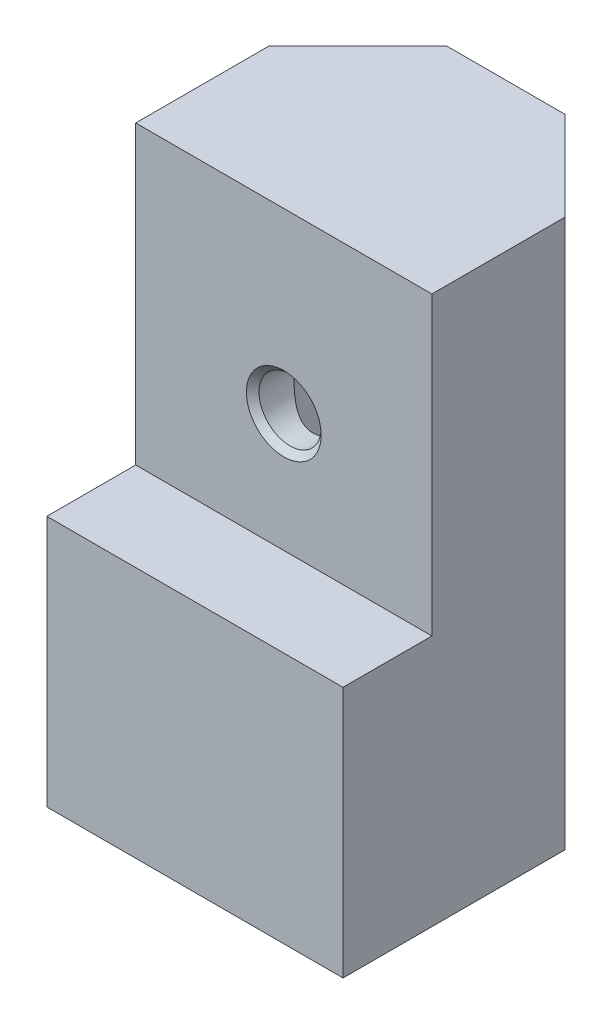
ISO-10303-21;
HEADER;
FILE_DESCRIPTION(('STEP AP214'),'2;1');
FILE_NAME('part.step','',(''),(''),'','','');
FILE_SCHEMA(('AUTOMOTIVE_DESIGN { 1 0 10303 214 1 1 1 1 }'));
ENDSEC;
DATA;
#1=APPLICATION_CONTEXT('core data for automotive mechanical design processes');
#2=APPLICATION_PROTOCOL_DEFINITION('international standard','automotive_design',2000,#1);
#3=PRODUCT_CONTEXT('',#1,'mechanical');
#4=PRODUCT('Part','Part','',(#3));
#5=PRODUCT_RELATED_PRODUCT_CATEGORY('part','',(#4));
#6=PRODUCT_DEFINITION_FORMATION('','',#4);
#7=PRODUCT_DEFINITION_CONTEXT('part definition',#1,'design');
#8=PRODUCT_DEFINITION('design','',#6,#7);
#9=PRODUCT_DEFINITION_SHAPE('','',#8);
#10=(LENGTH_UNIT() NAMED_UNIT(*) SI_UNIT(.MILLI.,.METRE.));
#11=(NAMED_UNIT(*) PLANE_ANGLE_UNIT() SI_UNIT($,.RADIAN.));
#12=(NAMED_UNIT(*) SI_UNIT($,.STERADIAN.) SOLID_ANGLE_UNIT());
#13=UNCERTAINTY_MEASURE_WITH_UNIT(LENGTH_MEASURE(1.E-05),#10,'distance_accuracy_value','');
#14=(GEOMETRIC_REPRESENTATION_CONTEXT(3) GLOBAL_UNCERTAINTY_ASSIGNED_CONTEXT((#13)) GLOBAL_UNIT_ASSIGNED_CONTEXT((#10,
#11,#12)) REPRESENTATION_CONTEXT('',''));
#15=CARTESIAN_POINT('',(0.,0.,0.));
#16=DIRECTION('',(0.,0.,1.));
#17=DIRECTION('',(1.,0.,0.));
#18=AXIS2_PLACEMENT_3D('',#15,#16,#17);
#19=CARTESIAN_POINT('',(0.,16.5,0.));
#20=DIRECTION('',(0.,0.,1.));
#21=DIRECTION('',(1.,0.,0.));
#22=AXIS2_PLACEMENT_3D('',#19,#20,#21);
#23=CYLINDRICAL_SURFACE('',#22,2.09999999999999);
#24=CARTESIAN_POINT('',(0.,16.5,-0.425000000000001));
#25=DIRECTION('',(0.,0.,1.));
#26=DIRECTION('',(1.,0.,0.));
#27=AXIS2_PLACEMENT_3D('',#24,#25,#26);
#28=CIRCLE('',#27,2.1);
#29=CARTESIAN_POINT('',(2.1,16.5,-0.425000000000001));
#30=VERTEX_POINT('',#29);
#31=EDGE_CURVE('E186',#30,#30,#28,.T.);
#32=ORIENTED_EDGE('',*,*,#31,.T.);
#33=EDGE_LOOP('',(#32));
#34=FACE_BOUND('',#33,.T.);
#35=CARTESIAN_POINT('',(0.,16.5,-9.8));
#36=DIRECTION('',(0.,0.,1.));
#37=DIRECTION('',(1.,0.,0.));
#38=AXIS2_PLACEMENT_3D('',#35,#36,#37);
#39=CIRCLE('',#38,2.09999999999999);
#40=CARTESIAN_POINT('',(2.09999999999999,16.5,-9.8));
#41=VERTEX_POINT('',#40);
#42=EDGE_CURVE('E189',#41,#41,#39,.T.);
#43=ORIENTED_EDGE('',*,*,#42,.F.);
#44=EDGE_LOOP('',(#43));
#45=FACE_BOUND('',#44,.T.);
#46=DIRECTION('',(0.,0.,1.));
#47=VECTOR('',#46,1.);
#48=CARTESIAN_POINT('',(2.1,16.5,0.));
#49=LINE('',#48,#47);
#50=CARTESIAN_POINT('',(2.1,16.5,-2.78810036394053));
#51=VERTEX_POINT('',#50);
#52=CARTESIAN_POINT('',(2.1,16.5,-7.21189963605947));
#53=VERTEX_POINT('',#52);
#54=EDGE_CURVE('E125',#51,#53,#49,.F.);
#55=ORIENTED_EDGE('',*,*,#54,.F.);
#56=CARTESIAN_POINT('',(2.1,16.5,-2.78810036394053));
#57=CARTESIAN_POINT('',(2.10001406550202,16.44890564578,-2.78813122960637));
#58=CARTESIAN_POINT('',(2.09813591396976,16.3978309349453,-2.78633076818849));
#59=CARTESIAN_POINT('',(2.09070878581308,16.2962603617513,-2.7793056900791));
#60=CARTESIAN_POINT('',(2.08516529758865,16.2457637485934,-2.77408619308978));
#61=CARTESIAN_POINT('',(2.07059789933959,16.1462622089026,-2.76053225536017));
#62=CARTESIAN_POINT('',(2.06161140051655,16.0972471565233,-2.75223132612759));
#63=CARTESIAN_POINT('',(2.04033021335461,16.0004917958691,-2.73289602787303));
#64=CARTESIAN_POINT('',(2.02803443434097,15.9527519135781,-2.7218607577605));
#65=CARTESIAN_POINT('',(1.98662417018042,15.8124015041972,-2.68544440520967));
#66=CARTESIAN_POINT('',(1.95288630713199,15.7220005483784,-2.65665274536502));
#67=CARTESIAN_POINT('',(1.87432121286916,15.5481200215617,-2.5933490864818));
#68=CARTESIAN_POINT('',(1.82946027170129,15.4646625399468,-2.55881980573055));
#69=CARTESIAN_POINT('',(1.72126821431826,15.2919981107851,-2.48109648006271));
#70=CARTESIAN_POINT('',(1.65610436927869,15.2041543502147,-2.43741786333745));
#71=CARTESIAN_POINT('',(1.51288716119124,15.0394906861281,-2.35033763996556));
#72=CARTESIAN_POINT('',(1.43482699231496,14.9626766435914,-2.30693619221924));
#73=CARTESIAN_POINT('',(1.25307146604847,14.8100170616356,-2.21716908070368));
#74=CARTESIAN_POINT('',(1.14727349331478,14.7362693244472,-2.17143013855408));
#75=CARTESIAN_POINT('',(0.921039956696543,14.6083128106554,-2.08992195742543));
#76=CARTESIAN_POINT('',(0.800631462785345,14.5540686159494,-2.05413467346997));
#77=CARTESIAN_POINT('',(0.581766959089313,14.4798028224355,-2.0044767996672));
#78=CARTESIAN_POINT('',(0.48582187503762,14.4545388431992,-1.98732083723429));
#79=CARTESIAN_POINT('',(0.290171999516886,14.4177700899993,-1.9622383894417));
#80=CARTESIAN_POINT('',(0.190470256332846,14.4062543980712,-1.9543045806005));
#81=CARTESIAN_POINT('',(-0.0100357823659216,14.3976231729419,-1.94836457385758));
#82=CARTESIAN_POINT('',(-0.110841743212122,14.4005336706207,-1.95037632188338));
#83=CARTESIAN_POINT('',(-0.310340753496205,14.4206381075267,-1.96418159812264));
#84=CARTESIAN_POINT('',(-0.409033179059682,14.4378362061511,-1.97597797482941));
#85=CARTESIAN_POINT('',(-0.59961992575892,14.4850787360832,-2.00799157758927));
#86=CARTESIAN_POINT('',(-0.691611709166461,14.514854663305,-2.02803258109019));
#87=CARTESIAN_POINT('',(-0.869119023411998,14.5858993090503,-2.07500891605762));
#88=CARTESIAN_POINT('',(-0.954633392230693,14.6271700835164,-2.10194548077899));
#89=CARTESIAN_POINT('',(-1.12720624367349,14.7250831477644,-2.16429143398575));
#90=CARTESIAN_POINT('',(-1.21335468088979,14.7829329037665,-2.20031329893575));
#91=CARTESIAN_POINT('',(-1.37528820402201,14.9096620634372,-2.27619794390948));
#92=CARTESIAN_POINT('',(-1.4510612472954,14.978554085896,-2.31606509720986));
#93=CARTESIAN_POINT('',(-1.60377665051855,15.1390367903445,-2.40395775706974));
#94=CARTESIAN_POINT('',(-1.67864220745733,15.2324919452245,-2.45219893140183));
#95=CARTESIAN_POINT('',(-1.81209350603637,15.4319643949111,-2.54532526320275));
#96=CARTESIAN_POINT('',(-1.87068403840911,15.5379779798706,-2.59021140541254));
#97=CARTESIAN_POINT('',(-1.95753033435109,15.7341115195755,-2.66057706952803));
#98=CARTESIAN_POINT('',(-1.98970157463716,15.8217540044552,-2.68811635077189));
#99=CARTESIAN_POINT('',(-2.04237434747996,16.0025061717334,-2.734508457242));
#100=CARTESIAN_POINT('',(-2.06291693598073,16.0955953230122,-2.75339179749609));
#101=CARTESIAN_POINT('',(-2.08463272386927,16.241237318493,-2.77358753707706));
#102=CARTESIAN_POINT('',(-2.09037039538955,16.2925842608368,-2.77898731101835));
#103=CARTESIAN_POINT('',(-2.09806402040135,16.395939884468,-2.78626161901712));
#104=CARTESIAN_POINT('',(-2.10001013542928,16.4479499357716,-2.78812698151683));
#105=CARTESIAN_POINT('',(-2.09999999999999,16.5,-2.78810036394053));
#106=B_SPLINE_CURVE_WITH_KNOTS('',3,(#56,#57,#58,#59,#60,#61,#62,#63,#64,#65,#66,#67,#68,#69,
#70,#71,#72,#73,#74,#75,#76,#77,#78,#79,#80,#81,#82,#83,#84,#85,#86,#87,#88,#89,#90,#91,#92,#93,
#94,#95,#96,#97,#98,#99,#100,#101,#102,#103,#104,#105),.UNSPECIFIED.,.F.,.F.,(4,2,2,2,2,2,2,2,2,
2,2,2,2,2,2,2,2,2,2,2,2,2,2,2,4),(0.,0.153185243370379,0.306141628187108,0.45748110256166,
0.608870516710041,0.909651176419752,1.21135477861481,1.56338559805909,1.91560279307157,
2.32384851334951,2.73134907659973,3.03211266815019,3.33263725428451,3.63370430967053,
3.93485904223187,4.22988618534556,4.52496613027641,4.85326702019536,5.18194579362882,
5.56763385280446,5.95320825985618,6.24423203568071,6.5342218143046,6.68982713941108,
6.84583569970781),.UNSPECIFIED.);
#107=CARTESIAN_POINT('',(-2.09999999999999,16.5,-2.78810036394053));
#108=VERTEX_POINT('',#107);
#109=EDGE_CURVE('E140',#51,#108,#106,.T.);
#110=ORIENTED_EDGE('',*,*,#109,.T.);
#111=DIRECTION('',(0.,0.,1.));
#112=VECTOR('',#111,1.);
#113=CARTESIAN_POINT('',(-2.09999999999999,16.5,0.));
#114=LINE('',#113,#112);
#115=CARTESIAN_POINT('',(-2.09999999999999,16.5,-7.21189963605947));
#116=VERTEX_POINT('',#115);
#117=EDGE_CURVE('E144',#116,#108,#114,.T.);
#118=ORIENTED_EDGE('',*,*,#117,.F.);
#119=CARTESIAN_POINT('',(-2.09999999999999,16.5,-7.21189963605947));
#120=CARTESIAN_POINT('',(-2.10001406550202,16.44890564578,-7.21186877039364));
#121=CARTESIAN_POINT('',(-2.09813591396976,16.3978309349453,-7.21366923181151));
#122=CARTESIAN_POINT('',(-2.09070878581308,16.2962603617513,-7.2206943099209));
#123=CARTESIAN_POINT('',(-2.08516529758865,16.2457637485934,-7.22591380691022));
#124=CARTESIAN_POINT('',(-2.07059789933958,16.1462622089026,-7.23946774463983));
#125=CARTESIAN_POINT('',(-2.06161140051654,16.0972471565233,-7.24776867387241));
#126=CARTESIAN_POINT('',(-2.04033021335461,16.0004917958691,-7.26710397212697));
#127=CARTESIAN_POINT('',(-2.02803443434096,15.9527519135781,-7.2781392422395));
#128=CARTESIAN_POINT('',(-1.98662417018042,15.8124015041972,-7.31455559479033));
#129=CARTESIAN_POINT('',(-1.95288630713199,15.7220005483784,-7.34334725463498));
#130=CARTESIAN_POINT('',(-1.87432121286915,15.5481200215617,-7.4066509135182));
#131=CARTESIAN_POINT('',(-1.82946027170128,15.4646625399468,-7.44118019426945));
#132=CARTESIAN_POINT('',(-1.72126821431826,15.2919981107851,-7.51890351993729));
#133=CARTESIAN_POINT('',(-1.65610436927869,15.2041543502147,-7.56258213666256));
#134=CARTESIAN_POINT('',(-1.51288716119123,15.0394906861281,-7.64966236003444));
#135=CARTESIAN_POINT('',(-1.43482699231496,14.9626766435914,-7.69306380778076));
#136=CARTESIAN_POINT('',(-1.25307146604846,14.8100170616356,-7.78283091929632));
#137=CARTESIAN_POINT('',(-1.14727349331478,14.7362693244472,-7.82856986144592));
#138=CARTESIAN_POINT('',(-0.921039956696539,14.6083128106554,-7.91007804257457));
#139=CARTESIAN_POINT('',(-0.800631462785341,14.5540686159494,-7.94586532653003));
#140=CARTESIAN_POINT('',(-0.581766959089311,14.4798028224355,-7.99552320033279));
#141=CARTESIAN_POINT('',(-0.485821875037618,14.4545388431992,-8.0126791627657));
#142=CARTESIAN_POINT('',(-0.290171999516883,14.4177700899993,-8.0377616105583));
#143=CARTESIAN_POINT('',(-0.190470256332844,14.4062543980712,-8.04569541939949));
#144=CARTESIAN_POINT('',(0.0100357823659245,14.3976231729419,-8.05163542614242));
#145=CARTESIAN_POINT('',(0.110841743212125,14.4005336706207,-8.04962367811662));
#146=CARTESIAN_POINT('',(0.310340753496208,14.4206381075267,-8.03581840187736));
#147=CARTESIAN_POINT('',(0.409033179059685,14.4378362061511,-8.02402202517059));
#148=CARTESIAN_POINT('',(0.599619925758922,14.4850787360832,-7.99200842241073));
#149=CARTESIAN_POINT('',(0.691611709166463,14.514854663305,-7.97196741890981));
#150=CARTESIAN_POINT('',(0.869119023412,14.5858993090503,-7.92499108394238));
#151=CARTESIAN_POINT('',(0.954633392230695,14.6271700835164,-7.89805451922101));
#152=CARTESIAN_POINT('',(1.12720624367349,14.7250831477644,-7.83570856601425));
#153=CARTESIAN_POINT('',(1.21335468088979,14.7829329037665,-7.79968670106425));
#154=CARTESIAN_POINT('',(1.37528820402201,14.9096620634372,-7.72380205609051));
#155=CARTESIAN_POINT('',(1.4510612472954,14.978554085896,-7.68393490279013));
#156=CARTESIAN_POINT('',(1.60377665051855,15.1390367903445,-7.59604224293026));
#157=CARTESIAN_POINT('',(1.67864220745734,15.2324919452245,-7.54780106859816));
#158=CARTESIAN_POINT('',(1.81209350603637,15.4319643949111,-7.45467473679724));
#159=CARTESIAN_POINT('',(1.87068403840912,15.5379779798706,-7.40978859458746));
#160=CARTESIAN_POINT('',(1.95753033435109,15.7341115195755,-7.33942293047197));
#161=CARTESIAN_POINT('',(1.98970157463716,15.8217540044552,-7.31188364922811));
#162=CARTESIAN_POINT('',(2.04237434747997,16.0025061717334,-7.26549154275799));
#163=CARTESIAN_POINT('',(2.06291693598074,16.0955953230122,-7.24660820250391));
#164=CARTESIAN_POINT('',(2.08463272386927,16.241237318493,-7.22641246292294));
#165=CARTESIAN_POINT('',(2.09037039538955,16.2925842608368,-7.22101268898165));
#166=CARTESIAN_POINT('',(2.09806402040135,16.395939884468,-7.21373838098287));
#167=CARTESIAN_POINT('',(2.10001013542928,16.4479499357716,-7.21187301848316));
#168=CARTESIAN_POINT('',(2.1,16.5,-7.21189963605947));
#169=B_SPLINE_CURVE_WITH_KNOTS('',3,(#119,#120,#121,#122,#123,#124,#125,#126,#127,#128,#129,
#130,#131,#132,#133,#134,#135,#136,#137,#138,#139,#140,#141,#142,#143,#144,#145,#146,#147,#148,
#149,#150,#151,#152,#153,#154,#155,#156,#157,#158,#159,#160,#161,#162,#163,#164,#165,#166,#167,
#168),.UNSPECIFIED.,.F.,.F.,(4,2,2,2,2,2,2,2,2,2,2,2,2,2,2,2,2,2,2,2,2,2,2,2,4),(0.,
0.153185243370379,0.306141628187108,0.45748110256166,0.608870516710041,0.909651176419752,
1.21135477861481,1.56338559805909,1.91560279307157,2.32384851334951,2.73134907659973,
3.03211266815019,3.33263725428451,3.63370430967053,3.93485904223187,4.22988618534556,
4.52496613027641,4.85326702019536,5.18194579362881,5.56763385280446,5.95320825985617,
6.24423203568071,6.53422181430459,6.68982713941108,6.84583569970781),.UNSPECIFIED.);
#170=EDGE_CURVE('E133',#116,#53,#169,.T.);
#171=ORIENTED_EDGE('',*,*,#170,.T.);
#172=EDGE_LOOP('',(#55,#110,#118,#171));
#173=FACE_BOUND('',#172,.T.);
#174=ADVANCED_FACE('F43',(#34,#45,#173),#23,.F.);
#175=CARTESIAN_POINT('',(-10.,8.5,6.));
#176=DIRECTION('',(1.,0.,0.));
#177=DIRECTION('',(0.,1.,0.));
#178=AXIS2_PLACEMENT_3D('',#175,#176,#177);
#179=PLANE('',#178);
#180=DIRECTION('',(0.,0.,1.));
#181=VECTOR('',#180,1.);
#182=CARTESIAN_POINT('',(-10.,28.5,-15.));
#183=LINE('',#182,#181);
#184=CARTESIAN_POINT('',(-10.,28.5,-8.99999999999998));
#185=VERTEX_POINT('',#184);
#186=CARTESIAN_POINT('',(-10.,28.5,0.));
#187=VERTEX_POINT('',#186);
#188=EDGE_CURVE('E212',#185,#187,#183,.T.);
#189=ORIENTED_EDGE('',*,*,#188,.F.);
#190=DIRECTION('',(0.,-1.,0.));
#191=VECTOR('',#190,1.);
#192=CARTESIAN_POINT('',(-10.,8.5,-8.99999999999998));
#193=LINE('',#192,#191);
#194=CARTESIAN_POINT('',(-10.,-8.5,-8.99999999999998));
#195=VERTEX_POINT('',#194);
#196=EDGE_CURVE('E66',#185,#195,#193,.T.);
#197=ORIENTED_EDGE('',*,*,#196,.T.);
#198=DIRECTION('',(0.,0.,-1.));
#199=VECTOR('',#198,1.);
#200=CARTESIAN_POINT('',(-10.,-8.5,6.));
#201=LINE('',#200,#199);
#202=CARTESIAN_POINT('',(-10.,-8.5,6.));
#203=VERTEX_POINT('',#202);
#204=EDGE_CURVE('E234',#203,#195,#201,.T.);
#205=ORIENTED_EDGE('',*,*,#204,.F.);
#206=DIRECTION('',(0.,-1.,0.));
#207=VECTOR('',#206,1.);
#208=CARTESIAN_POINT('',(-10.,8.5,6.));
#209=LINE('',#208,#207);
#210=CARTESIAN_POINT('',(-10.,8.5,6.));
#211=VERTEX_POINT('',#210);
#212=EDGE_CURVE('E215',#211,#203,#209,.T.);
#213=ORIENTED_EDGE('',*,*,#212,.F.);
#214=DIRECTION('',(0.,0.,-1.));
#215=VECTOR('',#214,1.);
#216=CARTESIAN_POINT('',(-10.,8.5,6.));
#217=LINE('',#216,#215);
#218=CARTESIAN_POINT('',(-10.,8.5,0.));
#219=VERTEX_POINT('',#218);
#220=EDGE_CURVE('E224',#211,#219,#217,.T.);
#221=ORIENTED_EDGE('',*,*,#220,.T.);
#222=DIRECTION('',(0.,1.,0.));
#223=VECTOR('',#222,1.);
#224=CARTESIAN_POINT('',(-10.,-8.5,0.));
#225=LINE('',#224,#223);
#226=EDGE_CURVE('E194',#219,#187,#225,.T.);
#227=ORIENTED_EDGE('',*,*,#226,.T.);
#228=EDGE_LOOP('',(#189,#197,#205,#213,#221,#227));
#229=FACE_BOUND('',#228,.T.);
#230=ADVANCED_FACE('F177',(#229),#179,.F.);
#231=CARTESIAN_POINT('',(-10.,-8.5,6.));
#232=DIRECTION('',(0.,1.,0.));
#233=DIRECTION('',(0.,0.,1.));
#234=AXIS2_PLACEMENT_3D('',#231,#232,#233);
#235=PLANE('',#234);
#236=CARTESIAN_POINT('',(0.,-8.5,-5.));
#237=DIRECTION('',(0.,-1.,0.));
#238=DIRECTION('',(0.,0.,-1.));
#239=AXIS2_PLACEMENT_3D('',#236,#237,#238);
#240=CIRCLE('',#239,3.05);
#241=CARTESIAN_POINT('',(0.,-8.5,-8.05));
#242=VERTEX_POINT('',#241);
#243=EDGE_CURVE('E237',#242,#242,#240,.T.);
#244=ORIENTED_EDGE('',*,*,#243,.F.);
#245=EDGE_LOOP('',(#244));
#246=FACE_BOUND('',#245,.T.);
#247=ORIENTED_EDGE('',*,*,#204,.T.);
#248=DIRECTION('',(-0.707106781186546,0.,0.707106781186549));
#249=VECTOR('',#248,1.);
#250=CARTESIAN_POINT('',(-4.,-8.5,-15.));
#251=LINE('',#250,#249);
#252=CARTESIAN_POINT('',(-4.,-8.5,-15.));
#253=VERTEX_POINT('',#252);
#254=EDGE_CURVE('E51',#195,#253,#251,.F.);
#255=ORIENTED_EDGE('',*,*,#254,.T.);
#256=DIRECTION('',(-1.,0.,0.));
#257=VECTOR('',#256,1.);
#258=CARTESIAN_POINT('',(10.,-8.5,-15.));
#259=LINE('',#258,#257);
#260=CARTESIAN_POINT('',(4.,-8.5,-15.));
#261=VERTEX_POINT('',#260);
#262=EDGE_CURVE('E199',#261,#253,#259,.T.);
#263=ORIENTED_EDGE('',*,*,#262,.F.);
#264=DIRECTION('',(-0.707106781186546,0.,-0.707106781186549));
#265=VECTOR('',#264,1.);
#266=CARTESIAN_POINT('',(4.,-8.5,-15.));
#267=LINE('',#266,#265);
#268=CARTESIAN_POINT('',(10.,-8.5,-8.99999999999998));
#269=VERTEX_POINT('',#268);
#270=EDGE_CURVE('E58',#261,#269,#267,.F.);
#271=ORIENTED_EDGE('',*,*,#270,.T.);
#272=DIRECTION('',(0.,0.,-1.));
#273=VECTOR('',#272,1.);
#274=CARTESIAN_POINT('',(10.,-8.5,6.));
#275=LINE('',#274,#273);
#276=CARTESIAN_POINT('',(10.,-8.5,6.));
#277=VERTEX_POINT('',#276);
#278=EDGE_CURVE('E232',#277,#269,#275,.T.);
#279=ORIENTED_EDGE('',*,*,#278,.F.);
#280=DIRECTION('',(1.,0.,0.));
#281=VECTOR('',#280,1.);
#282=CARTESIAN_POINT('',(-10.,-8.5,6.));
#283=LINE('',#282,#281);
#284=EDGE_CURVE('E218',#203,#277,#283,.T.);
#285=ORIENTED_EDGE('',*,*,#284,.F.);
#286=EDGE_LOOP('',(#247,#255,#263,#271,#279,#285));
#287=FACE_BOUND('',#286,.T.);
#288=ADVANCED_FACE('F182',(#246,#287),#235,.F.);
#289=CARTESIAN_POINT('',(10.,8.5,6.));
#290=DIRECTION('',(-1.,0.,0.));
#291=DIRECTION('',(0.,-1.,0.));
#292=AXIS2_PLACEMENT_3D('',#289,#290,#291);
#293=PLANE('',#292);
#294=ORIENTED_EDGE('',*,*,#278,.T.);
#295=DIRECTION('',(0.,1.,0.));
#296=VECTOR('',#295,1.);
#297=CARTESIAN_POINT('',(10.,8.5,-8.99999999999998));
#298=LINE('',#297,#296);
#299=CARTESIAN_POINT('',(10.,28.5,-8.99999999999998));
#300=VERTEX_POINT('',#299);
#301=EDGE_CURVE('E11',#269,#300,#298,.T.);
#302=ORIENTED_EDGE('',*,*,#301,.T.);
#303=DIRECTION('',(0.,0.,1.));
#304=VECTOR('',#303,1.);
#305=CARTESIAN_POINT('',(10.,28.5,-15.));
#306=LINE('',#305,#304);
#307=CARTESIAN_POINT('',(10.,28.5,0.));
#308=VERTEX_POINT('',#307);
#309=EDGE_CURVE('E205',#300,#308,#306,.T.);
#310=ORIENTED_EDGE('',*,*,#309,.T.);
#311=DIRECTION('',(0.,-1.,0.));
#312=VECTOR('',#311,1.);
#313=CARTESIAN_POINT('',(10.,-8.5,0.));
#314=LINE('',#313,#312);
#315=CARTESIAN_POINT('',(10.,8.5,0.));
#316=VERTEX_POINT('',#315);
#317=EDGE_CURVE('E191',#308,#316,#314,.T.);
#318=ORIENTED_EDGE('',*,*,#317,.T.);
#319=DIRECTION('',(0.,0.,-1.));
#320=VECTOR('',#319,1.);
#321=CARTESIAN_POINT('',(10.,8.5,6.));
#322=LINE('',#321,#320);
#323=CARTESIAN_POINT('',(10.,8.5,6.));
#324=VERTEX_POINT('',#323);
#325=EDGE_CURVE('E229',#324,#316,#322,.T.);
#326=ORIENTED_EDGE('',*,*,#325,.F.);
#327=DIRECTION('',(0.,1.,0.));
#328=VECTOR('',#327,1.);
#329=CARTESIAN_POINT('',(10.,8.5,6.));
#330=LINE('',#329,#328);
#331=EDGE_CURVE('E220',#277,#324,#330,.T.);
#332=ORIENTED_EDGE('',*,*,#331,.F.);
#333=EDGE_LOOP('',(#294,#302,#310,#318,#326,#332));
#334=FACE_BOUND('',#333,.T.);
#335=ADVANCED_FACE('F255',(#334),#293,.F.);
#336=CARTESIAN_POINT('',(-10.,8.5,6.));
#337=DIRECTION('',(0.,-1.,0.));
#338=DIRECTION('',(0.,0.,-1.));
#339=AXIS2_PLACEMENT_3D('',#336,#337,#338);
#340=PLANE('',#339);
#341=DIRECTION('',(-1.,0.,0.));
#342=VECTOR('',#341,1.);
#343=CARTESIAN_POINT('',(-10.,8.5,0.));
#344=LINE('',#343,#342);
#345=EDGE_CURVE('E214',#316,#219,#344,.T.);
#346=ORIENTED_EDGE('',*,*,#345,.T.);
#347=ORIENTED_EDGE('',*,*,#220,.F.);
#348=DIRECTION('',(-1.,0.,0.));
#349=VECTOR('',#348,1.);
#350=CARTESIAN_POINT('',(-10.,8.5,6.));
#351=LINE('',#350,#349);
#352=EDGE_CURVE('E222',#324,#211,#351,.T.);
#353=ORIENTED_EDGE('',*,*,#352,.F.);
#354=ORIENTED_EDGE('',*,*,#325,.T.);
#355=EDGE_LOOP('',(#346,#347,#353,#354));
#356=FACE_BOUND('',#355,.T.);
#357=ADVANCED_FACE('F259',(#356),#340,.F.);
#358=CARTESIAN_POINT('',(0.,0.,6.));
#359=DIRECTION('',(0.,0.,1.));
#360=DIRECTION('',(1.,0.,0.));
#361=AXIS2_PLACEMENT_3D('',#358,#359,#360);
#362=PLANE('',#361);
#363=ORIENTED_EDGE('',*,*,#212,.T.);
#364=ORIENTED_EDGE('',*,*,#284,.T.);
#365=ORIENTED_EDGE('',*,*,#331,.T.);
#366=ORIENTED_EDGE('',*,*,#352,.T.);
#367=EDGE_LOOP('',(#363,#364,#365,#366));
#368=FACE_BOUND('',#367,.T.);
#369=ADVANCED_FACE('F247',(#368),#362,.T.);
#370=CARTESIAN_POINT('',(0.,0.,0.));
#371=DIRECTION('',(0.,0.,1.));
#372=DIRECTION('',(1.,0.,0.));
#373=AXIS2_PLACEMENT_3D('',#370,#371,#372);
#374=PLANE('',#373);
#375=CARTESIAN_POINT('',(0.,16.5,0.));
#376=DIRECTION('',(0.,0.,1.));
#377=DIRECTION('',(1.,0.,0.));
#378=AXIS2_PLACEMENT_3D('',#375,#376,#377);
#379=CIRCLE('',#378,2.525);
#380=CARTESIAN_POINT('',(2.525,16.5,0.));
#381=VERTEX_POINT('',#380);
#382=EDGE_CURVE('E141',#381,#381,#379,.T.);
#383=ORIENTED_EDGE('',*,*,#382,.F.);
#384=EDGE_LOOP('',(#383));
#385=FACE_BOUND('',#384,.T.);
#386=ORIENTED_EDGE('',*,*,#345,.F.);
#387=ORIENTED_EDGE('',*,*,#317,.F.);
#388=DIRECTION('',(1.,0.,0.));
#389=VECTOR('',#388,1.);
#390=CARTESIAN_POINT('',(10.,28.5,0.));
#391=LINE('',#390,#389);
#392=EDGE_CURVE('E203',#187,#308,#391,.T.);
#393=ORIENTED_EDGE('',*,*,#392,.F.);
#394=ORIENTED_EDGE('',*,*,#226,.F.);
#395=EDGE_LOOP('',(#386,#387,#393,#394));
#396=FACE_BOUND('',#395,.T.);
#397=ADVANCED_FACE('F243',(#385,#396),#374,.T.);
#398=CARTESIAN_POINT('',(10.,28.5,-15.));
#399=DIRECTION('',(0.,-1.,0.));
#400=DIRECTION('',(0.,0.,-1.));
#401=AXIS2_PLACEMENT_3D('',#398,#399,#400);
#402=PLANE('',#401);
#403=DIRECTION('',(1.,0.,0.));
#404=VECTOR('',#403,1.);
#405=CARTESIAN_POINT('',(10.,28.5,-15.));
#406=LINE('',#405,#404);
#407=CARTESIAN_POINT('',(-4.00000000000001,28.5,-15.));
#408=VERTEX_POINT('',#407);
#409=CARTESIAN_POINT('',(4.,28.5,-15.));
#410=VERTEX_POINT('',#409);
#411=EDGE_CURVE('E202',#408,#410,#406,.T.);
#412=ORIENTED_EDGE('',*,*,#411,.F.);
#413=DIRECTION('',(0.707106781186546,0.,-0.707106781186549));
#414=VECTOR('',#413,1.);
#415=CARTESIAN_POINT('',(-4.,28.5,-15.));
#416=LINE('',#415,#414);
#417=EDGE_CURVE('E270',#408,#185,#416,.F.);
#418=ORIENTED_EDGE('',*,*,#417,.T.);
#419=ORIENTED_EDGE('',*,*,#188,.T.);
#420=ORIENTED_EDGE('',*,*,#392,.T.);
#421=ORIENTED_EDGE('',*,*,#309,.F.);
#422=DIRECTION('',(0.707106781186546,0.,0.707106781186549));
#423=VECTOR('',#422,1.);
#424=CARTESIAN_POINT('',(4.,28.5,-15.));
#425=LINE('',#424,#423);
#426=EDGE_CURVE('E267',#300,#410,#425,.F.);
#427=ORIENTED_EDGE('',*,*,#426,.T.);
#428=EDGE_LOOP('',(#412,#418,#419,#420,#421,#427));
#429=FACE_BOUND('',#428,.T.);
#430=ADVANCED_FACE('F246',(#429),#402,.F.);
#431=CARTESIAN_POINT('',(0.,0.,-15.));
#432=DIRECTION('',(0.,0.,1.));
#433=DIRECTION('',(1.,0.,0.));
#434=AXIS2_PLACEMENT_3D('',#431,#432,#433);
#435=PLANE('',#434);
#436=ORIENTED_EDGE('',*,*,#262,.T.);
#437=DIRECTION('',(0.,1.,0.));
#438=VECTOR('',#437,1.);
#439=CARTESIAN_POINT('',(-4.,0.,-15.));
#440=LINE('',#439,#438);
#441=EDGE_CURVE('E271',#253,#408,#440,.T.);
#442=ORIENTED_EDGE('',*,*,#441,.T.);
#443=ORIENTED_EDGE('',*,*,#411,.T.);
#444=DIRECTION('',(0.,-1.,0.));
#445=VECTOR('',#444,1.);
#446=CARTESIAN_POINT('',(4.,0.,-15.));
#447=LINE('',#446,#445);
#448=EDGE_CURVE('E132',#410,#261,#447,.T.);
#449=ORIENTED_EDGE('',*,*,#448,.T.);
#450=EDGE_LOOP('',(#436,#442,#443,#449));
#451=FACE_BOUND('',#450,.T.);
#452=ADVANCED_FACE('F172',(#451),#435,.F.);
#453=CARTESIAN_POINT('',(0.,16.5,-9.8));
#454=DIRECTION('',(0.,0.,1.));
#455=DIRECTION('',(1.,0.,0.));
#456=AXIS2_PLACEMENT_3D('',#453,#454,#455);
#457=CONICAL_SURFACE('',#456,2.09999999999999,1.02974425867665);
#458=CARTESIAN_POINT('',(0.,16.5,-11.0618072999579));
#459=VERTEX_POINT('',#458);
#460=VERTEX_LOOP('',#459);
#461=FACE_BOUND('',#460,.T.);
#462=ORIENTED_EDGE('',*,*,#42,.T.);
#463=EDGE_LOOP('',(#462));
#464=FACE_BOUND('',#463,.T.);
#465=ADVANCED_FACE('F167',(#461,#464),#457,.F.);
#466=CARTESIAN_POINT('',(0.,16.5,0.));
#467=DIRECTION('',(0.,0.,1.));
#468=DIRECTION('',(1.,0.,0.));
#469=AXIS2_PLACEMENT_3D('',#466,#467,#468);
#470=CONICAL_SURFACE('',#469,2.525,0.785398163397446);
#471=ORIENTED_EDGE('',*,*,#31,.F.);
#472=EDGE_LOOP('',(#471));
#473=FACE_BOUND('',#472,.T.);
#474=ORIENTED_EDGE('',*,*,#382,.T.);
#475=EDGE_LOOP('',(#474));
#476=FACE_BOUND('',#475,.T.);
#477=ADVANCED_FACE('F163',(#473,#476),#470,.F.);
#478=CARTESIAN_POINT('',(0.,16.5,-5.));
#479=DIRECTION('',(0.,-1.,0.));
#480=DIRECTION('',(0.,0.,-1.));
#481=AXIS2_PLACEMENT_3D('',#478,#479,#480);
#482=CYLINDRICAL_SURFACE('',#481,3.05);
#483=ORIENTED_EDGE('',*,*,#243,.T.);
#484=EDGE_LOOP('',(#483));
#485=FACE_BOUND('',#484,.T.);
#486=CARTESIAN_POINT('',(0.,16.5,-5.));
#487=DIRECTION('',(0.,-1.,0.));
#488=DIRECTION('',(0.,0.,-1.));
#489=AXIS2_PLACEMENT_3D('',#486,#487,#488);
#490=CIRCLE('',#489,3.05);
#491=EDGE_CURVE('E142',#108,#116,#490,.T.);
#492=ORIENTED_EDGE('',*,*,#491,.F.);
#493=ORIENTED_EDGE('',*,*,#109,.F.);
#494=EDGE_CURVE('E128',#53,#51,#490,.T.);
#495=ORIENTED_EDGE('',*,*,#494,.F.);
#496=ORIENTED_EDGE('',*,*,#170,.F.);
#497=EDGE_LOOP('',(#492,#493,#495,#496));
#498=FACE_BOUND('',#497,.T.);
#499=ADVANCED_FACE('F138',(#485,#498),#482,.F.);
#500=CARTESIAN_POINT('',(0.,16.5,-5.));
#501=DIRECTION('',(0.,-1.,0.));
#502=DIRECTION('',(0.,0.,-1.));
#503=AXIS2_PLACEMENT_3D('',#500,#501,#502);
#504=PLANE('',#503);
#505=ORIENTED_EDGE('',*,*,#54,.T.);
#506=ORIENTED_EDGE('',*,*,#494,.T.);
#507=EDGE_LOOP('',(#505,#506));
#508=FACE_BOUND('',#507,.T.);
#509=ADVANCED_FACE('F127',(#508),#504,.T.);
#510=ORIENTED_EDGE('',*,*,#117,.T.);
#511=ORIENTED_EDGE('',*,*,#491,.T.);
#512=EDGE_LOOP('',(#510,#511));
#513=FACE_BOUND('',#512,.T.);
#514=ADVANCED_FACE('F236',(#513),#504,.T.);
#515=CARTESIAN_POINT('',(-4.,0.,-15.));
#516=DIRECTION('',(0.707106781186549,0.,0.707106781186546));
#517=DIRECTION('',(0.,1.,0.));
#518=AXIS2_PLACEMENT_3D('',#515,#516,#517);
#519=PLANE('',#518);
#520=ORIENTED_EDGE('',*,*,#254,.F.);
#521=ORIENTED_EDGE('',*,*,#196,.F.);
#522=ORIENTED_EDGE('',*,*,#417,.F.);
#523=ORIENTED_EDGE('',*,*,#441,.F.);
#524=EDGE_LOOP('',(#520,#521,#522,#523));
#525=FACE_BOUND('',#524,.T.);
#526=ADVANCED_FACE('F282',(#525),#519,.F.);
#527=CARTESIAN_POINT('',(4.,0.,-15.));
#528=DIRECTION('',(-0.707106781186549,0.,0.707106781186546));
#529=DIRECTION('',(0.,-1.,0.));
#530=AXIS2_PLACEMENT_3D('',#527,#528,#529);
#531=PLANE('',#530);
#532=ORIENTED_EDGE('',*,*,#426,.F.);
#533=ORIENTED_EDGE('',*,*,#301,.F.);
#534=ORIENTED_EDGE('',*,*,#270,.F.);
#535=ORIENTED_EDGE('',*,*,#448,.F.);
#536=EDGE_LOOP('',(#532,#533,#534,#535));
#537=FACE_BOUND('',#536,.T.);
#538=ADVANCED_FACE('F45',(#537),#531,.F.);
#539=CLOSED_SHELL('',(#174,#230,#288,#335,#357,#369,#397,#430,#452,#465,#477,#499,#509,#514,
#526,#538));
#540=MANIFOLD_SOLID_BREP('B2',#539);
#541=ADVANCED_BREP_SHAPE_REPRESENTATION('',(#18,#540),#14);
#542=SHAPE_DEFINITION_REPRESENTATION(#9,#541);
ENDSEC;
END-ISO-10303-21;
